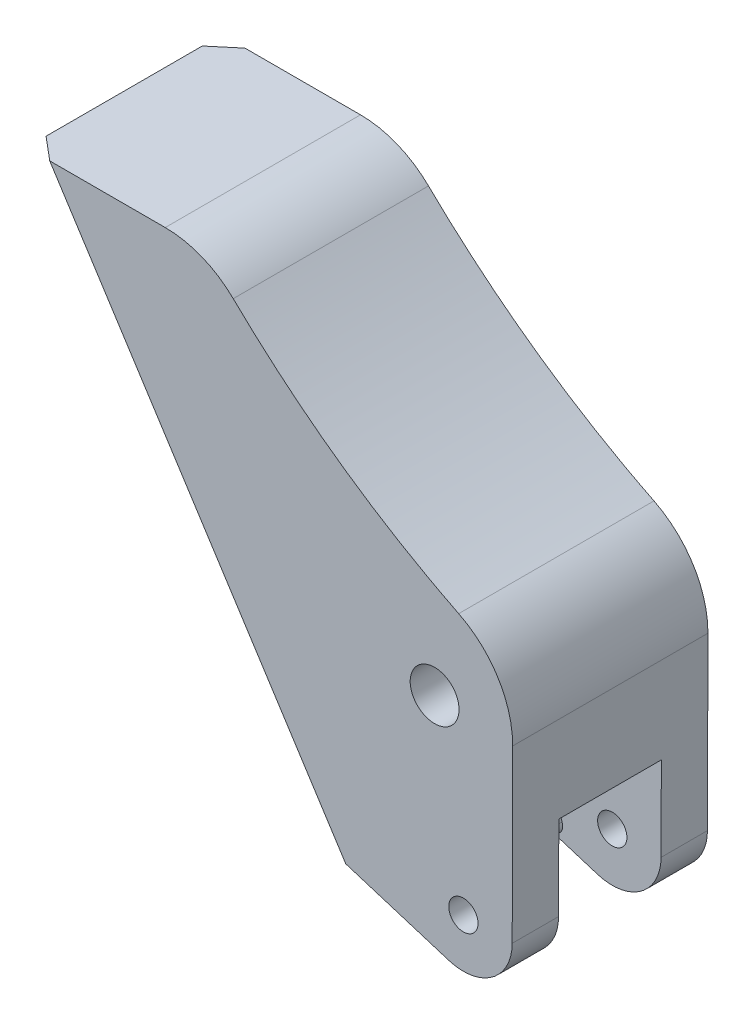
ISO-10303-21;
HEADER;
FILE_DESCRIPTION(('STEP AP214'),'2;1');
FILE_NAME('part.step','',(''),(''),'','','');
FILE_SCHEMA(('AUTOMOTIVE_DESIGN { 1 0 10303 214 1 1 1 1 }'));
ENDSEC;
DATA;
#1=APPLICATION_CONTEXT('core data for automotive mechanical design processes');
#2=APPLICATION_PROTOCOL_DEFINITION('international standard','automotive_design',2000,#1);
#3=PRODUCT_CONTEXT('',#1,'mechanical');
#4=PRODUCT('Part','Part','',(#3));
#5=PRODUCT_RELATED_PRODUCT_CATEGORY('part','',(#4));
#6=PRODUCT_DEFINITION_FORMATION('','',#4);
#7=PRODUCT_DEFINITION_CONTEXT('part definition',#1,'design');
#8=PRODUCT_DEFINITION('design','',#6,#7);
#9=PRODUCT_DEFINITION_SHAPE('','',#8);
#10=(LENGTH_UNIT() NAMED_UNIT(*) SI_UNIT(.MILLI.,.METRE.));
#11=(NAMED_UNIT(*) PLANE_ANGLE_UNIT() SI_UNIT($,.RADIAN.));
#12=(NAMED_UNIT(*) SI_UNIT($,.STERADIAN.) SOLID_ANGLE_UNIT());
#13=UNCERTAINTY_MEASURE_WITH_UNIT(LENGTH_MEASURE(1.E-05),#10,'distance_accuracy_value','');
#14=(GEOMETRIC_REPRESENTATION_CONTEXT(3) GLOBAL_UNCERTAINTY_ASSIGNED_CONTEXT((#13)) GLOBAL_UNIT_ASSIGNED_CONTEXT((#10,
#11,#12)) REPRESENTATION_CONTEXT('',''));
#15=CARTESIAN_POINT('',(0.,0.,0.));
#16=DIRECTION('',(0.,0.,1.));
#17=DIRECTION('',(1.,0.,0.));
#18=AXIS2_PLACEMENT_3D('',#15,#16,#17);
#19=CARTESIAN_POINT('',(-20.0849417814243,-23.7769237854635,20.));
#20=DIRECTION('',(0.297098491561862,0.954846839190279,0.));
#21=DIRECTION('',(-0.954846839190279,0.297098491561862,0.));
#22=AXIS2_PLACEMENT_3D('',#19,#20,#21);
#23=PLANE('',#22);
#24=DIRECTION('',(0.954846839190279,-0.297098491561861,0.));
#25=VECTOR('',#24,1.);
#26=CARTESIAN_POINT('',(-11.4433740578771,-26.4657285550041,4.75));
#27=LINE('',#26,#25);
#28=CARTESIAN_POINT('',(-11.4433740578771,-26.4657285550041,4.75));
#29=VERTEX_POINT('',#28);
#30=CARTESIAN_POINT('',(-6.55123978276332,-27.9879053628437,4.75));
#31=VERTEX_POINT('',#30);
#32=EDGE_CURVE('E185',#29,#31,#27,.T.);
#33=ORIENTED_EDGE('',*,*,#32,.F.);
#34=DIRECTION('',(0.,0.,-1.));
#35=VECTOR('',#34,1.);
#36=CARTESIAN_POINT('',(-11.4433740578771,-26.4657285550041,20.));
#37=LINE('',#36,#35);
#38=CARTESIAN_POINT('',(-11.4433740578771,-26.4657285550041,15.25));
#39=VERTEX_POINT('',#38);
#40=EDGE_CURVE('E302',#29,#39,#37,.F.);
#41=ORIENTED_EDGE('',*,*,#40,.T.);
#42=DIRECTION('',(-0.954846839190279,0.297098491561862,0.));
#43=VECTOR('',#42,1.);
#44=CARTESIAN_POINT('',(-6.55123978276332,-27.9879053628437,15.25));
#45=LINE('',#44,#43);
#46=CARTESIAN_POINT('',(-6.55123978276332,-27.9879053628437,15.25));
#47=VERTEX_POINT('',#46);
#48=EDGE_CURVE('E192',#47,#39,#45,.T.);
#49=ORIENTED_EDGE('',*,*,#48,.F.);
#50=DIRECTION('',(0.,0.,-1.));
#51=VECTOR('',#50,1.);
#52=CARTESIAN_POINT('',(-6.55123978276332,-27.9879053628437,20.));
#53=LINE('',#52,#51);
#54=CARTESIAN_POINT('',(-6.55123978276332,-27.9879053628437,20.));
#55=VERTEX_POINT('',#54);
#56=EDGE_CURVE('E312',#47,#55,#53,.F.);
#57=ORIENTED_EDGE('',*,*,#56,.T.);
#58=DIRECTION('',(0.954846839190279,-0.297098491561862,0.));
#59=VECTOR('',#58,1.);
#60=CARTESIAN_POINT('',(-20.0849417814243,-23.7769237854635,20.));
#61=LINE('',#60,#59);
#62=CARTESIAN_POINT('',(-17.113985823963,-24.7013301899577,20.));
#63=VERTEX_POINT('',#62);
#64=EDGE_CURVE('E400',#63,#55,#61,.T.);
#65=ORIENTED_EDGE('',*,*,#64,.F.);
#66=DIRECTION('',(-0.803222012389881,0.249920760561644,-0.54071620306094));
#67=VECTOR('',#66,1.);
#68=CARTESIAN_POINT('',(-23.0832925853273,-22.843993534819,15.9815582278338));
#69=LINE('',#68,#67);
#70=CARTESIAN_POINT('',(-20.0849417814243,-23.7769237854635,18.));
#71=VERTEX_POINT('',#70);
#72=EDGE_CURVE('E338',#63,#71,#69,.T.);
#73=ORIENTED_EDGE('',*,*,#72,.T.);
#74=DIRECTION('',(0.,0.,-1.));
#75=VECTOR('',#74,1.);
#76=CARTESIAN_POINT('',(-20.0849417814243,-23.7769237854635,20.));
#77=LINE('',#76,#75);
#78=CARTESIAN_POINT('',(-20.0849417814243,-23.7769237854635,1.99999999999999));
#79=VERTEX_POINT('',#78);
#80=EDGE_CURVE('E402',#71,#79,#77,.T.);
#81=ORIENTED_EDGE('',*,*,#80,.T.);
#82=DIRECTION('',(-0.803222012389882,0.249920760561645,0.540716203060938));
#83=VECTOR('',#82,1.);
#84=CARTESIAN_POINT('',(-48.5527574423353,-14.9192256251072,21.1640778715795));
#85=LINE('',#84,#83);
#86=CARTESIAN_POINT('',(-17.113985823963,-24.7013301899577,0.));
#87=VERTEX_POINT('',#86);
#88=EDGE_CURVE('E340',#79,#87,#85,.F.);
#89=ORIENTED_EDGE('',*,*,#88,.T.);
#90=DIRECTION('',(0.954846839190279,-0.297098491561862,0.));
#91=VECTOR('',#90,1.);
#92=CARTESIAN_POINT('',(-20.0849417814243,-23.7769237854635,0.));
#93=LINE('',#92,#91);
#94=CARTESIAN_POINT('',(-6.55123978276332,-27.9879053628437,0.));
#95=VERTEX_POINT('',#94);
#96=EDGE_CURVE('E398',#87,#95,#93,.T.);
#97=ORIENTED_EDGE('',*,*,#96,.T.);
#98=EDGE_CURVE('E318',#95,#31,#53,.F.);
#99=ORIENTED_EDGE('',*,*,#98,.T.);
#100=EDGE_LOOP('',(#33,#41,#49,#57,#65,#73,#81,#89,#97,#99));
#101=FACE_BOUND('',#100,.T.);
#102=ADVANCED_FACE('F34',(#101),#23,.F.);
#103=CARTESIAN_POINT('',(-5.06574732495401,-23.2136711668923,20.));
#104=DIRECTION('',(0.,0.,-1.));
#105=DIRECTION('',(-1.,0.,0.));
#106=AXIS2_PLACEMENT_3D('',#103,#104,#105);
#107=CYLINDRICAL_SURFACE('',#106,5.);
#108=DIRECTION('',(0.,0.,-1.));
#109=VECTOR('',#108,1.);
#110=CARTESIAN_POINT('',(-0.0657673669559318,-23.227828130463,20.));
#111=LINE('',#110,#109);
#112=CARTESIAN_POINT('',(-0.0657673669559331,-23.227828130463,4.75));
#113=VERTEX_POINT('',#112);
#114=CARTESIAN_POINT('',(-0.0657673669559318,-23.227828130463,0.));
#115=VERTEX_POINT('',#114);
#116=EDGE_CURVE('E411',#113,#115,#111,.T.);
#117=ORIENTED_EDGE('',*,*,#116,.F.);
#118=CARTESIAN_POINT('',(-5.06574732495401,-23.2136711668923,4.75));
#119=DIRECTION('',(0.,0.,1.));
#120=DIRECTION('',(1.,0.,0.));
#121=AXIS2_PLACEMENT_3D('',#118,#119,#120);
#122=CIRCLE('',#121,5.);
#123=EDGE_CURVE('E187',#31,#113,#122,.T.);
#124=ORIENTED_EDGE('',*,*,#123,.F.);
#125=ORIENTED_EDGE('',*,*,#98,.F.);
#126=CARTESIAN_POINT('',(-5.06574732495401,-23.2136711668923,0.));
#127=DIRECTION('',(0.,0.,1.));
#128=DIRECTION('',(1.,0.,0.));
#129=AXIS2_PLACEMENT_3D('',#126,#127,#128);
#130=CIRCLE('',#129,5.);
#131=EDGE_CURVE('E319',#115,#95,#130,.F.);
#132=ORIENTED_EDGE('',*,*,#131,.F.);
#133=EDGE_LOOP('',(#117,#124,#125,#132));
#134=FACE_BOUND('',#133,.T.);
#135=ADVANCED_FACE('F263',(#134),#107,.T.);
#136=CARTESIAN_POINT('',(-5.06574732495401,-23.2136711668923,-4.));
#137=DIRECTION('',(0.,0.,1.));
#138=DIRECTION('',(1.,0.,0.));
#139=AXIS2_PLACEMENT_3D('',#136,#137,#138);
#140=CYLINDRICAL_SURFACE('',#139,1.5);
#141=CARTESIAN_POINT('',(-5.06574732495401,-23.2136711668923,0.));
#142=DIRECTION('',(0.,0.,1.));
#143=DIRECTION('',(1.,0.,0.));
#144=AXIS2_PLACEMENT_3D('',#141,#142,#143);
#145=CIRCLE('',#144,1.5);
#146=CARTESIAN_POINT('',(-3.56574732495401,-23.2136711668923,0.));
#147=VERTEX_POINT('',#146);
#148=EDGE_CURVE('E329',#147,#147,#145,.T.);
#149=ORIENTED_EDGE('',*,*,#148,.F.);
#150=EDGE_LOOP('',(#149));
#151=FACE_BOUND('',#150,.T.);
#152=CARTESIAN_POINT('',(-5.06574732495401,-23.2136711668923,4.75));
#153=DIRECTION('',(0.,0.,1.));
#154=DIRECTION('',(1.,0.,0.));
#155=AXIS2_PLACEMENT_3D('',#152,#153,#154);
#156=CIRCLE('',#155,1.5);
#157=CARTESIAN_POINT('',(-3.56574732495401,-23.2136711668923,4.75));
#158=VERTEX_POINT('',#157);
#159=EDGE_CURVE('E38',#158,#158,#156,.F.);
#160=ORIENTED_EDGE('',*,*,#159,.F.);
#161=EDGE_LOOP('',(#160));
#162=FACE_BOUND('',#161,.T.);
#163=ADVANCED_FACE('F251',(#151,#162),#140,.F.);
#164=ORIENTED_EDGE('',*,*,#56,.F.);
#165=CARTESIAN_POINT('',(-5.06574732495401,-23.2136711668923,15.25));
#166=DIRECTION('',(0.,0.,-1.));
#167=DIRECTION('',(-1.,0.,0.));
#168=AXIS2_PLACEMENT_3D('',#165,#166,#167);
#169=CIRCLE('',#168,5.);
#170=CARTESIAN_POINT('',(-0.0657673669559318,-23.227828130463,15.25));
#171=VERTEX_POINT('',#170);
#172=EDGE_CURVE('E190',#171,#47,#169,.T.);
#173=ORIENTED_EDGE('',*,*,#172,.F.);
#174=CARTESIAN_POINT('',(-0.0657673669559318,-23.227828130463,20.));
#175=VERTEX_POINT('',#174);
#176=EDGE_CURVE('E323',#175,#171,#111,.T.);
#177=ORIENTED_EDGE('',*,*,#176,.F.);
#178=CARTESIAN_POINT('',(-5.06574732495401,-23.2136711668923,20.));
#179=DIRECTION('',(0.,0.,1.));
#180=DIRECTION('',(1.,0.,0.));
#181=AXIS2_PLACEMENT_3D('',#178,#179,#180);
#182=CIRCLE('',#181,5.);
#183=EDGE_CURVE('E317',#55,#175,#182,.T.);
#184=ORIENTED_EDGE('',*,*,#183,.F.);
#185=EDGE_LOOP('',(#164,#173,#177,#184));
#186=FACE_BOUND('',#185,.T.);
#187=ADVANCED_FACE('F249',(#186),#107,.T.);
#188=CARTESIAN_POINT('',(-5.06574732495401,-23.2136711668923,20.));
#189=DIRECTION('',(0.,0.,1.));
#190=DIRECTION('',(1.,0.,0.));
#191=AXIS2_PLACEMENT_3D('',#188,#189,#190);
#192=CIRCLE('',#191,1.5);
#193=CARTESIAN_POINT('',(-3.56574732495401,-23.2136711668923,20.));
#194=VERTEX_POINT('',#193);
#195=EDGE_CURVE('E333',#194,#194,#192,.T.);
#196=ORIENTED_EDGE('',*,*,#195,.T.);
#197=EDGE_LOOP('',(#196));
#198=FACE_BOUND('',#197,.T.);
#199=CARTESIAN_POINT('',(-5.06574732495401,-23.2136711668923,15.25));
#200=DIRECTION('',(0.,0.,-1.));
#201=DIRECTION('',(-1.,0.,0.));
#202=AXIS2_PLACEMENT_3D('',#199,#200,#201);
#203=CIRCLE('',#202,1.5);
#204=CARTESIAN_POINT('',(-6.56574732495401,-23.2136711668923,15.25));
#205=VERTEX_POINT('',#204);
#206=EDGE_CURVE('E206',#205,#205,#203,.F.);
#207=ORIENTED_EDGE('',*,*,#206,.F.);
#208=EDGE_LOOP('',(#207));
#209=FACE_BOUND('',#208,.T.);
#210=ADVANCED_FACE('F246',(#198,#209),#140,.F.);
#211=CARTESIAN_POINT('',(-5.06574732496037,-23.2136711668901,43.2842712474775));
#212=DIRECTION('',(0.,0.,-1.));
#213=DIRECTION('',(-1.,0.,0.));
#214=AXIS2_PLACEMENT_3D('',#211,#212,#213);
#215=CYLINDRICAL_SURFACE('',#214,10.0000000000055);
#216=DIRECTION('',(0.,0.,-1.));
#217=VECTOR('',#216,1.);
#218=CARTESIAN_POINT('',(-0.0412467867705249,-14.5676088063794,43.2842712474775));
#219=LINE('',#218,#217);
#220=CARTESIAN_POINT('',(-0.0412467867705249,-14.5676088063794,4.75));
#221=VERTEX_POINT('',#220);
#222=CARTESIAN_POINT('',(-0.0412467867705237,-14.5676088063794,15.25));
#223=VERTEX_POINT('',#222);
#224=EDGE_CURVE('E164',#221,#223,#219,.F.);
#225=ORIENTED_EDGE('',*,*,#224,.T.);
#226=CARTESIAN_POINT('',(-5.06574732496037,-23.2136711668901,15.25));
#227=DIRECTION('',(0.,0.,-1.));
#228=DIRECTION('',(-1.,0.,0.));
#229=AXIS2_PLACEMENT_3D('',#226,#227,#228);
#230=CIRCLE('',#229,10.0000000000055);
#231=CARTESIAN_POINT('',(-14.8368193088888,-21.0861956006379,15.25));
#232=VERTEX_POINT('',#231);
#233=EDGE_CURVE('E160',#232,#223,#230,.T.);
#234=ORIENTED_EDGE('',*,*,#233,.F.);
#235=DIRECTION('',(0.,0.,-1.));
#236=VECTOR('',#235,1.);
#237=CARTESIAN_POINT('',(-14.8368193088888,-21.0861956006379,28.1344702820542));
#238=LINE('',#237,#236);
#239=CARTESIAN_POINT('',(-14.8368193088888,-21.0861956006379,4.75));
#240=VERTEX_POINT('',#239);
#241=EDGE_CURVE('E153',#232,#240,#238,.T.);
#242=ORIENTED_EDGE('',*,*,#241,.T.);
#243=CARTESIAN_POINT('',(-5.06574732496037,-23.2136711668901,4.75));
#244=DIRECTION('',(0.,0.,1.));
#245=DIRECTION('',(1.,0.,0.));
#246=AXIS2_PLACEMENT_3D('',#243,#244,#245);
#247=CIRCLE('',#246,10.0000000000055);
#248=EDGE_CURVE('E157',#221,#240,#247,.T.);
#249=ORIENTED_EDGE('',*,*,#248,.F.);
#250=EDGE_LOOP('',(#225,#234,#242,#249));
#251=FACE_BOUND('',#250,.T.);
#252=ADVANCED_FACE('F155',(#251),#215,.F.);
#253=CARTESIAN_POINT('',(-0.0849417814243339,-29.9998797479885,20.));
#254=DIRECTION('',(-0.999995991599615,0.00283139271414446,0.));
#255=DIRECTION('',(-0.00283139271414446,-0.999995991599615,0.));
#256=AXIS2_PLACEMENT_3D('',#253,#254,#255);
#257=PLANE('',#256);
#258=ORIENTED_EDGE('',*,*,#224,.F.);
#259=DIRECTION('',(0.00283139271414466,0.999995991599615,0.));
#260=VECTOR('',#259,1.);
#261=CARTESIAN_POINT('',(-0.0657673669559331,-23.227828130463,4.75));
#262=LINE('',#261,#260);
#263=EDGE_CURVE('E178',#113,#221,#262,.T.);
#264=ORIENTED_EDGE('',*,*,#263,.F.);
#265=ORIENTED_EDGE('',*,*,#116,.T.);
#266=DIRECTION('',(0.00283139271414446,0.999995991599615,0.));
#267=VECTOR('',#266,1.);
#268=CARTESIAN_POINT('',(-0.0849417814243339,-29.9998797479885,0.));
#269=LINE('',#268,#267);
#270=CARTESIAN_POINT('',(-0.0161222113724986,-5.69406944776002,0.));
#271=VERTEX_POINT('',#270);
#272=EDGE_CURVE('E332',#115,#271,#269,.T.);
#273=ORIENTED_EDGE('',*,*,#272,.T.);
#274=DIRECTION('',(0.,0.,1.));
#275=VECTOR('',#274,1.);
#276=CARTESIAN_POINT('',(-0.0161222113724986,-5.69406944776002,20.));
#277=LINE('',#276,#275);
#278=CARTESIAN_POINT('',(-0.0161222113724986,-5.69406944776002,20.));
#279=VERTEX_POINT('',#278);
#280=EDGE_CURVE('E365',#271,#279,#277,.T.);
#281=ORIENTED_EDGE('',*,*,#280,.T.);
#282=DIRECTION('',(0.00283139271414446,0.999995991599615,0.));
#283=VECTOR('',#282,1.);
#284=CARTESIAN_POINT('',(-0.0849417814243339,-29.9998797479885,20.));
#285=LINE('',#284,#283);
#286=EDGE_CURVE('E394',#175,#279,#285,.T.);
#287=ORIENTED_EDGE('',*,*,#286,.F.);
#288=ORIENTED_EDGE('',*,*,#176,.T.);
#289=DIRECTION('',(-0.00283139271414465,-0.999995991599615,0.));
#290=VECTOR('',#289,1.);
#291=CARTESIAN_POINT('',(-0.0412467867705237,-14.5676088063794,15.25));
#292=LINE('',#291,#290);
#293=EDGE_CURVE('E204',#223,#171,#292,.T.);
#294=ORIENTED_EDGE('',*,*,#293,.F.);
#295=EDGE_LOOP('',(#258,#264,#265,#273,#281,#287,#288,#294));
#296=FACE_BOUND('',#295,.T.);
#297=ADVANCED_FACE('F271',(#296),#257,.F.);
#298=CARTESIAN_POINT('',(-8.01479407705954,-5.21367116689229,-5.));
#299=DIRECTION('',(0.,0.,1.));
#300=DIRECTION('',(1.,0.,0.));
#301=AXIS2_PLACEMENT_3D('',#298,#299,#300);
#302=CYLINDRICAL_SURFACE('',#301,2.5);
#303=CARTESIAN_POINT('',(-8.01479407705954,-5.21367116689229,20.));
#304=DIRECTION('',(0.,0.,1.));
#305=DIRECTION('',(1.,0.,0.));
#306=AXIS2_PLACEMENT_3D('',#303,#304,#305);
#307=CIRCLE('',#306,2.5);
#308=CARTESIAN_POINT('',(-5.51479407705954,-5.21367116689229,20.));
#309=VERTEX_POINT('',#308);
#310=EDGE_CURVE('E357',#309,#309,#307,.T.);
#311=ORIENTED_EDGE('',*,*,#310,.T.);
#312=EDGE_LOOP('',(#311));
#313=FACE_BOUND('',#312,.T.);
#314=CARTESIAN_POINT('',(-8.01479407705954,-5.21367116689229,11.5));
#315=DIRECTION('',(0.,0.,-1.));
#316=DIRECTION('',(-1.,0.,0.));
#317=AXIS2_PLACEMENT_3D('',#314,#315,#316);
#318=CIRCLE('',#317,2.5);
#319=CARTESIAN_POINT('',(-10.5147940770595,-5.21367116689229,11.5));
#320=VERTEX_POINT('',#319);
#321=EDGE_CURVE('E353',#320,#320,#318,.F.);
#322=ORIENTED_EDGE('',*,*,#321,.F.);
#323=EDGE_LOOP('',(#322));
#324=FACE_BOUND('',#323,.T.);
#325=ADVANCED_FACE('F245',(#313,#324),#302,.F.);
#326=CARTESIAN_POINT('',(-26.8115555091642,22.4975663390289,20.));
#327=DIRECTION('',(0.,-1.,0.));
#328=DIRECTION('',(1.,0.,0.));
#329=AXIS2_PLACEMENT_3D('',#326,#327,#328);
#330=PLANE('',#329);
#331=DIRECTION('',(-1.,0.,0.));
#332=VECTOR('',#331,1.);
#333=CARTESIAN_POINT('',(-26.8115555091642,22.4975663390289,20.));
#334=LINE('',#333,#332);
#335=CARTESIAN_POINT('',(-35.604748058218,22.4975663390289,20.));
#336=VERTEX_POINT('',#335);
#337=CARTESIAN_POINT('',(-47.434435854165,22.4975663390289,20.));
#338=VERTEX_POINT('',#337);
#339=EDGE_CURVE('E397',#336,#338,#334,.T.);
#340=ORIENTED_EDGE('',*,*,#339,.F.);
#341=DIRECTION('',(0.,0.,1.));
#342=VECTOR('',#341,1.);
#343=CARTESIAN_POINT('',(-35.604748058218,22.4975663390289,20.));
#344=LINE('',#343,#342);
#345=CARTESIAN_POINT('',(-35.604748058218,22.4975663390289,0.));
#346=VERTEX_POINT('',#345);
#347=EDGE_CURVE('E43',#336,#346,#344,.F.);
#348=ORIENTED_EDGE('',*,*,#347,.T.);
#349=DIRECTION('',(-1.,0.,0.));
#350=VECTOR('',#349,1.);
#351=CARTESIAN_POINT('',(-26.8115555091642,22.4975663390289,0.));
#352=LINE('',#351,#350);
#353=CARTESIAN_POINT('',(-47.434435854165,22.4975663390289,0.));
#354=VERTEX_POINT('',#353);
#355=EDGE_CURVE('E405',#346,#354,#352,.T.);
#356=ORIENTED_EDGE('',*,*,#355,.T.);
#357=DIRECTION('',(0.765194224730699,0.,-0.643799501738534));
#358=VECTOR('',#357,1.);
#359=CARTESIAN_POINT('',(-49.8115555091642,22.4975663390289,2.));
#360=LINE('',#359,#358);
#361=CARTESIAN_POINT('',(-49.8115555091642,22.4975663390289,1.99999999999999));
#362=VERTEX_POINT('',#361);
#363=EDGE_CURVE('E348',#354,#362,#360,.F.);
#364=ORIENTED_EDGE('',*,*,#363,.T.);
#365=DIRECTION('',(0.,0.,-1.));
#366=VECTOR('',#365,1.);
#367=CARTESIAN_POINT('',(-49.8115555091642,22.4975663390289,20.));
#368=LINE('',#367,#366);
#369=CARTESIAN_POINT('',(-49.8115555091642,22.4975663390289,18.));
#370=VERTEX_POINT('',#369);
#371=EDGE_CURVE('E409',#370,#362,#368,.T.);
#372=ORIENTED_EDGE('',*,*,#371,.F.);
#373=DIRECTION('',(0.765194224730697,0.,0.643799501738536));
#374=VECTOR('',#373,1.);
#375=CARTESIAN_POINT('',(-33.3308509001323,22.4975663390289,31.866112775915));
#376=LINE('',#375,#374);
#377=EDGE_CURVE('E345',#370,#338,#376,.T.);
#378=ORIENTED_EDGE('',*,*,#377,.T.);
#379=EDGE_LOOP('',(#340,#348,#356,#364,#372,#378));
#380=FACE_BOUND('',#379,.T.);
#381=ADVANCED_FACE('F267',(#380),#330,.F.);
#382=CARTESIAN_POINT('',(-49.8115555091642,22.4975663390289,20.));
#383=DIRECTION('',(0.841354365899862,0.540483885958907,0.));
#384=DIRECTION('',(-0.540483885958907,0.841354365899863,0.));
#385=AXIS2_PLACEMENT_3D('',#382,#383,#384);
#386=PLANE('',#385);
#387=DIRECTION('',(0.540483885958907,-0.841354365899863,0.));
#388=VECTOR('',#387,1.);
#389=CARTESIAN_POINT('',(-49.8115555091642,22.4975663390289,1.99999999999999));
#390=LINE('',#389,#388);
#391=EDGE_CURVE('E335',#362,#79,#390,.T.);
#392=ORIENTED_EDGE('',*,*,#391,.T.);
#393=ORIENTED_EDGE('',*,*,#80,.F.);
#394=DIRECTION('',(-0.540483885958907,0.841354365899863,0.));
#395=VECTOR('',#394,1.);
#396=CARTESIAN_POINT('',(-49.8115555091642,22.4975663390289,18.));
#397=LINE('',#396,#395);
#398=EDGE_CURVE('E328',#71,#370,#397,.T.);
#399=ORIENTED_EDGE('',*,*,#398,.T.);
#400=ORIENTED_EDGE('',*,*,#371,.T.);
#401=EDGE_LOOP('',(#392,#393,#399,#400));
#402=FACE_BOUND('',#401,.T.);
#403=ADVANCED_FACE('F256',(#402),#386,.F.);
#404=CARTESIAN_POINT('',(0.,0.,20.));
#405=DIRECTION('',(0.,0.,1.));
#406=DIRECTION('',(1.,0.,0.));
#407=AXIS2_PLACEMENT_3D('',#404,#405,#406);
#408=PLANE('',#407);
#409=CARTESIAN_POINT('',(-31.431124160284,22.4975663390289,20.));
#410=CARTESIAN_POINT('',(-18.6711292769391,9.04460156814012,20.));
#411=CARTESIAN_POINT('',(-1.79266782620453,1.50422691179161,20.));
#412=B_SPLINE_CURVE_WITH_KNOTS('',2,(#409,#410,#411),.UNSPECIFIED.,.F.,.F.,(3,3),(0.,1.),.UNSPECIFIED.);
#413=CARTESIAN_POINT('',(-28.6392610689079,19.6726615301572,20.));
#414=VERTEX_POINT('',#413);
#415=CARTESIAN_POINT('',(-5.54419450911247,3.27864055344294,20.));
#416=VERTEX_POINT('',#415);
#417=EDGE_CURVE('E209',#414,#416,#412,.T.);
#418=ORIENTED_EDGE('',*,*,#417,.F.);
#419=CARTESIAN_POINT('',(-35.604748058218,12.4975663390289,20.));
#420=DIRECTION('',(0.,0.,1.));
#421=DIRECTION('',(1.,0.,0.));
#422=AXIS2_PLACEMENT_3D('',#419,#420,#421);
#423=CIRCLE('',#422,10.);
#424=EDGE_CURVE('E58',#414,#336,#423,.T.);
#425=ORIENTED_EDGE('',*,*,#424,.T.);
#426=ORIENTED_EDGE('',*,*,#339,.T.);
#427=DIRECTION('',(0.540483885958907,-0.841354365899862,0.));
#428=VECTOR('',#427,1.);
#429=CARTESIAN_POINT('',(-18.4022330496246,-22.6959560135457,20.));
#430=LINE('',#429,#428);
#431=EDGE_CURVE('E350',#338,#63,#430,.T.);
#432=ORIENTED_EDGE('',*,*,#431,.T.);
#433=ORIENTED_EDGE('',*,*,#64,.T.);
#434=ORIENTED_EDGE('',*,*,#183,.T.);
#435=ORIENTED_EDGE('',*,*,#286,.T.);
#436=CARTESIAN_POINT('',(-10.0160821273687,-5.66575552061857,20.));
#437=DIRECTION('',(0.,0.,1.));
#438=DIRECTION('',(1.,0.,0.));
#439=AXIS2_PLACEMENT_3D('',#436,#437,#438);
#440=CIRCLE('',#439,10.);
#441=EDGE_CURVE('E303',#279,#416,#440,.T.);
#442=ORIENTED_EDGE('',*,*,#441,.T.);
#443=EDGE_LOOP('',(#418,#425,#426,#432,#433,#434,#435,#442));
#444=FACE_BOUND('',#443,.T.);
#445=ORIENTED_EDGE('',*,*,#310,.F.);
#446=EDGE_LOOP('',(#445));
#447=FACE_BOUND('',#446,.T.);
#448=ORIENTED_EDGE('',*,*,#195,.F.);
#449=EDGE_LOOP('',(#448));
#450=FACE_BOUND('',#449,.T.);
#451=ADVANCED_FACE('F252',(#444,#447,#450),#408,.T.);
#452=CARTESIAN_POINT('',(0.,0.,0.));
#453=DIRECTION('',(0.,0.,1.));
#454=DIRECTION('',(1.,0.,0.));
#455=AXIS2_PLACEMENT_3D('',#452,#453,#454);
#456=PLANE('',#455);
#457=CARTESIAN_POINT('',(-8.01479407705954,-5.21367116689229,0.));
#458=DIRECTION('',(0.,0.,1.));
#459=DIRECTION('',(1.,0.,0.));
#460=AXIS2_PLACEMENT_3D('',#457,#458,#459);
#461=CIRCLE('',#460,2.5);
#462=CARTESIAN_POINT('',(-5.51479407705954,-5.21367116689229,0.));
#463=VERTEX_POINT('',#462);
#464=EDGE_CURVE('E354',#463,#463,#461,.T.);
#465=ORIENTED_EDGE('',*,*,#464,.T.);
#466=EDGE_LOOP('',(#465));
#467=FACE_BOUND('',#466,.T.);
#468=ORIENTED_EDGE('',*,*,#148,.T.);
#469=EDGE_LOOP('',(#468));
#470=FACE_BOUND('',#469,.T.);
#471=ORIENTED_EDGE('',*,*,#355,.F.);
#472=CARTESIAN_POINT('',(-35.604748058218,12.4975663390289,0.));
#473=DIRECTION('',(0.,0.,1.));
#474=DIRECTION('',(1.,0.,0.));
#475=AXIS2_PLACEMENT_3D('',#472,#473,#474);
#476=CIRCLE('',#475,10.);
#477=CARTESIAN_POINT('',(-28.6392610689079,19.6726615301572,0.));
#478=VERTEX_POINT('',#477);
#479=EDGE_CURVE('E11',#346,#478,#476,.F.);
#480=ORIENTED_EDGE('',*,*,#479,.T.);
#481=CARTESIAN_POINT('',(-31.431124160284,22.4975663390289,0.));
#482=CARTESIAN_POINT('',(-18.6711292769391,9.04460156814012,0.));
#483=CARTESIAN_POINT('',(-1.79266782620453,1.50422691179161,0.));
#484=B_SPLINE_CURVE_WITH_KNOTS('',2,(#481,#482,#483),.UNSPECIFIED.,.F.,.F.,(3,3),(0.,1.),.UNSPECIFIED.);
#485=CARTESIAN_POINT('',(-5.54419450911253,3.27864055344297,0.));
#486=VERTEX_POINT('',#485);
#487=EDGE_CURVE('E371',#478,#486,#484,.T.);
#488=ORIENTED_EDGE('',*,*,#487,.T.);
#489=CARTESIAN_POINT('',(-10.0160821273687,-5.66575552061857,0.));
#490=DIRECTION('',(0.,0.,1.));
#491=DIRECTION('',(1.,0.,0.));
#492=AXIS2_PLACEMENT_3D('',#489,#490,#491);
#493=CIRCLE('',#492,10.);
#494=EDGE_CURVE('E363',#486,#271,#493,.F.);
#495=ORIENTED_EDGE('',*,*,#494,.T.);
#496=ORIENTED_EDGE('',*,*,#272,.F.);
#497=ORIENTED_EDGE('',*,*,#131,.T.);
#498=ORIENTED_EDGE('',*,*,#96,.F.);
#499=DIRECTION('',(-0.540483885958907,0.841354365899862,0.));
#500=VECTOR('',#499,1.);
#501=CARTESIAN_POINT('',(-23.347245109856,-14.9982103556493,0.));
#502=LINE('',#501,#500);
#503=EDGE_CURVE('E342',#87,#354,#502,.T.);
#504=ORIENTED_EDGE('',*,*,#503,.T.);
#505=EDGE_LOOP('',(#471,#480,#488,#495,#496,#497,#498,#504));
#506=FACE_BOUND('',#505,.T.);
#507=ADVANCED_FACE('F255',(#467,#470,#506),#456,.F.);
#508=CARTESIAN_POINT('',(-49.8115555091642,22.4975663390289,2.));
#509=DIRECTION('',(0.594927377508701,0.3821798208836,0.707106781186547));
#510=DIRECTION('',(0.540483885958907,-0.841354365899863,0.));
#511=AXIS2_PLACEMENT_3D('',#508,#509,#510);
#512=PLANE('',#511);
#513=ORIENTED_EDGE('',*,*,#363,.F.);
#514=ORIENTED_EDGE('',*,*,#503,.F.);
#515=ORIENTED_EDGE('',*,*,#88,.F.);
#516=ORIENTED_EDGE('',*,*,#391,.F.);
#517=EDGE_LOOP('',(#513,#514,#515,#516));
#518=FACE_BOUND('',#517,.T.);
#519=ADVANCED_FACE('F259',(#518),#512,.F.);
#520=CARTESIAN_POINT('',(-23.347245109856,-14.9982103556493,20.));
#521=DIRECTION('',(-0.594927377508702,-0.382179820883601,0.707106781186546));
#522=DIRECTION('',(-0.540483885958907,0.841354365899863,0.));
#523=AXIS2_PLACEMENT_3D('',#520,#521,#522);
#524=PLANE('',#523);
#525=ORIENTED_EDGE('',*,*,#377,.F.);
#526=ORIENTED_EDGE('',*,*,#398,.F.);
#527=ORIENTED_EDGE('',*,*,#72,.F.);
#528=ORIENTED_EDGE('',*,*,#431,.F.);
#529=EDGE_LOOP('',(#525,#526,#527,#528));
#530=FACE_BOUND('',#529,.T.);
#531=ADVANCED_FACE('F243',(#530),#524,.T.);
#532=CARTESIAN_POINT('',(-8.01479407705954,-5.21367116689229,8.5));
#533=DIRECTION('',(0.,0.,-1.));
#534=DIRECTION('',(-1.,0.,0.));
#535=AXIS2_PLACEMENT_3D('',#532,#533,#534);
#536=CIRCLE('',#535,2.5);
#537=CARTESIAN_POINT('',(-10.5147940770595,-5.21367116689229,8.5));
#538=VERTEX_POINT('',#537);
#539=EDGE_CURVE('E385',#538,#538,#536,.T.);
#540=ORIENTED_EDGE('',*,*,#539,.F.);
#541=EDGE_LOOP('',(#540));
#542=FACE_BOUND('',#541,.T.);
#543=ORIENTED_EDGE('',*,*,#464,.F.);
#544=EDGE_LOOP('',(#543));
#545=FACE_BOUND('',#544,.T.);
#546=ADVANCED_FACE('F236',(#542,#545),#302,.F.);
#547=CARTESIAN_POINT('',(-8.01479407705954,-5.21367116689229,11.5));
#548=DIRECTION('',(0.,0.,-1.));
#549=DIRECTION('',(-1.,0.,0.));
#550=AXIS2_PLACEMENT_3D('',#547,#548,#549);
#551=PLANE('',#550);
#552=CARTESIAN_POINT('',(-8.01479407705954,-5.21367116689229,11.5));
#553=DIRECTION('',(0.,0.,-1.));
#554=DIRECTION('',(-1.,0.,0.));
#555=AXIS2_PLACEMENT_3D('',#552,#553,#554);
#556=CIRCLE('',#555,1.75);
#557=CARTESIAN_POINT('',(-9.76479407705954,-5.21367116689229,11.5));
#558=VERTEX_POINT('',#557);
#559=EDGE_CURVE('E379',#558,#558,#556,.T.);
#560=ORIENTED_EDGE('',*,*,#559,.T.);
#561=EDGE_LOOP('',(#560));
#562=FACE_BOUND('',#561,.T.);
#563=ORIENTED_EDGE('',*,*,#321,.T.);
#564=EDGE_LOOP('',(#563));
#565=FACE_BOUND('',#564,.T.);
#566=ADVANCED_FACE('F233',(#562,#565),#551,.F.);
#567=CARTESIAN_POINT('',(-8.01479407705954,-5.21367116689229,8.5));
#568=DIRECTION('',(0.,0.,-1.));
#569=DIRECTION('',(-1.,0.,0.));
#570=AXIS2_PLACEMENT_3D('',#567,#568,#569);
#571=PLANE('',#570);
#572=CARTESIAN_POINT('',(-8.01479407705954,-5.21367116689229,8.5));
#573=DIRECTION('',(0.,0.,-1.));
#574=DIRECTION('',(-1.,0.,0.));
#575=AXIS2_PLACEMENT_3D('',#572,#573,#574);
#576=CIRCLE('',#575,1.75);
#577=CARTESIAN_POINT('',(-9.76479407705954,-5.21367116689229,8.5));
#578=VERTEX_POINT('',#577);
#579=EDGE_CURVE('E373',#578,#578,#576,.T.);
#580=ORIENTED_EDGE('',*,*,#579,.F.);
#581=EDGE_LOOP('',(#580));
#582=FACE_BOUND('',#581,.T.);
#583=ORIENTED_EDGE('',*,*,#539,.T.);
#584=EDGE_LOOP('',(#583));
#585=FACE_BOUND('',#584,.T.);
#586=ADVANCED_FACE('F231',(#582,#585),#571,.T.);
#587=CARTESIAN_POINT('',(-8.01479407705954,-5.21367116689229,11.5));
#588=DIRECTION('',(0.,0.,-1.));
#589=DIRECTION('',(-1.,0.,0.));
#590=AXIS2_PLACEMENT_3D('',#587,#588,#589);
#591=CYLINDRICAL_SURFACE('',#590,1.75);
#592=ORIENTED_EDGE('',*,*,#559,.F.);
#593=EDGE_LOOP('',(#592));
#594=FACE_BOUND('',#593,.T.);
#595=ORIENTED_EDGE('',*,*,#579,.T.);
#596=EDGE_LOOP('',(#595));
#597=FACE_BOUND('',#596,.T.);
#598=ADVANCED_FACE('F226',(#594,#597),#591,.F.);
#599=CARTESIAN_POINT('',(-31.431124160284,22.4975663390289,-14.));
#600=CARTESIAN_POINT('',(-18.6711292769391,9.04460156814012,-14.));
#601=CARTESIAN_POINT('',(-1.79266782620453,1.50422691179161,-14.));
#602=B_SPLINE_CURVE_WITH_KNOTS('',2,(#599,#600,#601),.UNSPECIFIED.,.F.,.F.,(3,3),(0.,1.),.UNSPECIFIED.);
#603=DIRECTION('',(0.,0.,1.));
#604=VECTOR('',#603,1.);
#605=SURFACE_OF_LINEAR_EXTRUSION('',#602,#604);
#606=ORIENTED_EDGE('',*,*,#487,.F.);
#607=DIRECTION('',(0.,0.,1.));
#608=VECTOR('',#607,1.);
#609=CARTESIAN_POINT('',(-28.6392610689079,19.6726615301571,0.));
#610=LINE('',#609,#608);
#611=EDGE_CURVE('E370',#478,#414,#610,.T.);
#612=ORIENTED_EDGE('',*,*,#611,.T.);
#613=ORIENTED_EDGE('',*,*,#417,.T.);
#614=DIRECTION('',(0.,0.,1.));
#615=VECTOR('',#614,1.);
#616=CARTESIAN_POINT('',(-5.54419450911253,3.27864055344297,20.));
#617=LINE('',#616,#615);
#618=EDGE_CURVE('E360',#416,#486,#617,.F.);
#619=ORIENTED_EDGE('',*,*,#618,.T.);
#620=EDGE_LOOP('',(#606,#612,#613,#619));
#621=FACE_BOUND('',#620,.T.);
#622=ADVANCED_FACE('F221',(#621),#605,.F.);
#623=CARTESIAN_POINT('',(-10.0160821273687,-5.66575552061857,10.));
#624=DIRECTION('',(0.,0.,1.));
#625=DIRECTION('',(1.,0.,0.));
#626=AXIS2_PLACEMENT_3D('',#623,#624,#625);
#627=CYLINDRICAL_SURFACE('',#626,10.);
#628=ORIENTED_EDGE('',*,*,#441,.F.);
#629=ORIENTED_EDGE('',*,*,#280,.F.);
#630=ORIENTED_EDGE('',*,*,#494,.F.);
#631=ORIENTED_EDGE('',*,*,#618,.F.);
#632=EDGE_LOOP('',(#628,#629,#630,#631));
#633=FACE_BOUND('',#632,.T.);
#634=ADVANCED_FACE('F225',(#633),#627,.T.);
#635=CARTESIAN_POINT('',(-5.06574732496037,-23.2136711668901,28.1344702820542));
#636=DIRECTION('',(0.,0.,-1.));
#637=DIRECTION('',(-1.,0.,0.));
#638=AXIS2_PLACEMENT_3D('',#635,#636,#637);
#639=CYLINDRICAL_SURFACE('',#638,5.5);
#640=DIRECTION('',(0.,0.,-1.));
#641=VECTOR('',#640,1.);
#642=CARTESIAN_POINT('',(-10.439836916118,-22.043559605452,28.1344702820542));
#643=LINE('',#642,#641);
#644=CARTESIAN_POINT('',(-10.439836916118,-22.043559605452,15.25));
#645=VERTEX_POINT('',#644);
#646=CARTESIAN_POINT('',(-10.439836916118,-22.043559605452,4.75));
#647=VERTEX_POINT('',#646);
#648=EDGE_CURVE('E165',#645,#647,#643,.T.);
#649=ORIENTED_EDGE('',*,*,#648,.F.);
#650=CARTESIAN_POINT('',(-5.06574732496037,-23.2136711668901,15.25));
#651=DIRECTION('',(0.,0.,-1.));
#652=DIRECTION('',(-1.,0.,0.));
#653=AXIS2_PLACEMENT_3D('',#650,#651,#652);
#654=CIRCLE('',#653,5.5);
#655=CARTESIAN_POINT('',(-10.2108096830298,-25.1574647082871,15.25));
#656=VERTEX_POINT('',#655);
#657=EDGE_CURVE('E198',#656,#645,#654,.T.);
#658=ORIENTED_EDGE('',*,*,#657,.F.);
#659=DIRECTION('',(0.,0.,-1.));
#660=VECTOR('',#659,1.);
#661=CARTESIAN_POINT('',(-10.2108096830298,-25.1574647082871,28.1344702820542));
#662=LINE('',#661,#660);
#663=CARTESIAN_POINT('',(-10.2108096830298,-25.1574647082871,4.75));
#664=VERTEX_POINT('',#663);
#665=EDGE_CURVE('E299',#656,#664,#662,.T.);
#666=ORIENTED_EDGE('',*,*,#665,.T.);
#667=CARTESIAN_POINT('',(-5.06574732496037,-23.2136711668901,4.75));
#668=DIRECTION('',(0.,0.,1.));
#669=DIRECTION('',(1.,0.,0.));
#670=AXIS2_PLACEMENT_3D('',#667,#668,#669);
#671=CIRCLE('',#670,5.5);
#672=EDGE_CURVE('E173',#647,#664,#671,.T.);
#673=ORIENTED_EDGE('',*,*,#672,.F.);
#674=EDGE_LOOP('',(#649,#658,#666,#673));
#675=FACE_BOUND('',#674,.T.);
#676=ADVANCED_FACE('F285',(#675),#639,.F.);
#677=CARTESIAN_POINT('',(-10.439836916118,-22.043559605452,28.1344702820542));
#678=DIRECTION('',(-0.212747556625105,-0.977107198392299,0.));
#679=DIRECTION('',(0.977107198392299,-0.212747556625105,0.));
#680=AXIS2_PLACEMENT_3D('',#677,#678,#679);
#681=PLANE('',#680);
#682=ORIENTED_EDGE('',*,*,#241,.F.);
#683=DIRECTION('',(-0.977107198392299,0.212747556625105,0.));
#684=VECTOR('',#683,1.);
#685=CARTESIAN_POINT('',(-10.439836916118,-22.043559605452,15.25));
#686=LINE('',#685,#684);
#687=EDGE_CURVE('E201',#645,#232,#686,.T.);
#688=ORIENTED_EDGE('',*,*,#687,.F.);
#689=ORIENTED_EDGE('',*,*,#648,.T.);
#690=DIRECTION('',(0.977107198392299,-0.212747556625105,0.));
#691=VECTOR('',#690,1.);
#692=CARTESIAN_POINT('',(-14.8368193088888,-21.0861956006379,4.75));
#693=LINE('',#692,#691);
#694=EDGE_CURVE('E168',#240,#647,#693,.T.);
#695=ORIENTED_EDGE('',*,*,#694,.F.);
#696=EDGE_LOOP('',(#682,#688,#689,#695));
#697=FACE_BOUND('',#696,.T.);
#698=ADVANCED_FACE('F169',(#697),#681,.F.);
#699=CARTESIAN_POINT('',(-11.1462755663152,-25.5108817158138,28.1344702820542));
#700=DIRECTION('',(0.,0.,-1.));
#701=DIRECTION('',(-1.,0.,0.));
#702=AXIS2_PLACEMENT_3D('',#699,#700,#701);
#703=CYLINDRICAL_SURFACE('',#702,1.);
#704=ORIENTED_EDGE('',*,*,#665,.F.);
#705=CARTESIAN_POINT('',(-11.1462755663152,-25.5108817158138,15.25));
#706=DIRECTION('',(0.,0.,1.));
#707=DIRECTION('',(-1.,0.,0.));
#708=AXIS2_PLACEMENT_3D('',#705,#706,#707);
#709=CIRCLE('',#708,0.999999999999997);
#710=EDGE_CURVE('E195',#39,#656,#709,.T.);
#711=ORIENTED_EDGE('',*,*,#710,.F.);
#712=ORIENTED_EDGE('',*,*,#40,.F.);
#713=CARTESIAN_POINT('',(-11.1462755663152,-25.5108817158138,4.75));
#714=DIRECTION('',(0.,0.,-1.));
#715=DIRECTION('',(1.,0.,0.));
#716=AXIS2_PLACEMENT_3D('',#713,#714,#715);
#717=CIRCLE('',#716,1.);
#718=EDGE_CURVE('E182',#664,#29,#717,.T.);
#719=ORIENTED_EDGE('',*,*,#718,.F.);
#720=EDGE_LOOP('',(#704,#711,#712,#719));
#721=FACE_BOUND('',#720,.T.);
#722=ADVANCED_FACE('F287',(#721),#703,.T.);
#723=CARTESIAN_POINT('',(-35.604748058218,12.4975663390289,10.));
#724=DIRECTION('',(0.,0.,1.));
#725=DIRECTION('',(1.,0.,0.));
#726=AXIS2_PLACEMENT_3D('',#723,#724,#725);
#727=CYLINDRICAL_SURFACE('',#726,10.);
#728=ORIENTED_EDGE('',*,*,#479,.F.);
#729=ORIENTED_EDGE('',*,*,#347,.F.);
#730=ORIENTED_EDGE('',*,*,#424,.F.);
#731=ORIENTED_EDGE('',*,*,#611,.F.);
#732=EDGE_LOOP('',(#728,#729,#730,#731));
#733=FACE_BOUND('',#732,.T.);
#734=ADVANCED_FACE('F36',(#733),#727,.T.);
#735=CARTESIAN_POINT('',(-5.06574732495401,-23.2136711668923,15.25));
#736=DIRECTION('',(0.,0.,-1.));
#737=DIRECTION('',(-1.,0.,0.));
#738=AXIS2_PLACEMENT_3D('',#735,#736,#737);
#739=PLANE('',#738);
#740=ORIENTED_EDGE('',*,*,#172,.T.);
#741=ORIENTED_EDGE('',*,*,#48,.T.);
#742=ORIENTED_EDGE('',*,*,#710,.T.);
#743=ORIENTED_EDGE('',*,*,#657,.T.);
#744=ORIENTED_EDGE('',*,*,#687,.T.);
#745=ORIENTED_EDGE('',*,*,#233,.T.);
#746=ORIENTED_EDGE('',*,*,#293,.T.);
#747=EDGE_LOOP('',(#740,#741,#742,#743,#744,#745,#746));
#748=FACE_BOUND('',#747,.T.);
#749=ORIENTED_EDGE('',*,*,#206,.T.);
#750=EDGE_LOOP('',(#749));
#751=FACE_BOUND('',#750,.T.);
#752=ADVANCED_FACE('F294',(#748,#751),#739,.T.);
#753=CARTESIAN_POINT('',(-5.06574732496037,-23.2136711668901,4.75));
#754=DIRECTION('',(0.,0.,1.));
#755=DIRECTION('',(1.,0.,0.));
#756=AXIS2_PLACEMENT_3D('',#753,#754,#755);
#757=PLANE('',#756);
#758=ORIENTED_EDGE('',*,*,#248,.T.);
#759=ORIENTED_EDGE('',*,*,#694,.T.);
#760=ORIENTED_EDGE('',*,*,#672,.T.);
#761=ORIENTED_EDGE('',*,*,#718,.T.);
#762=ORIENTED_EDGE('',*,*,#32,.T.);
#763=ORIENTED_EDGE('',*,*,#123,.T.);
#764=ORIENTED_EDGE('',*,*,#263,.T.);
#765=EDGE_LOOP('',(#758,#759,#760,#761,#762,#763,#764));
#766=FACE_BOUND('',#765,.T.);
#767=ORIENTED_EDGE('',*,*,#159,.T.);
#768=EDGE_LOOP('',(#767));
#769=FACE_BOUND('',#768,.T.);
#770=ADVANCED_FACE('F175',(#766,#769),#757,.T.);
#771=CLOSED_SHELL('',(#102,#135,#163,#187,#210,#252,#297,#325,#381,#403,#451,#507,#519,#531,
#546,#566,#586,#598,#622,#634,#676,#698,#722,#734,#752,#770));
#772=MANIFOLD_SOLID_BREP('B2',#771);
#773=ADVANCED_BREP_SHAPE_REPRESENTATION('',(#18,#772),#14);
#774=SHAPE_DEFINITION_REPRESENTATION(#9,#773);
ENDSEC;
END-ISO-10303-21;
